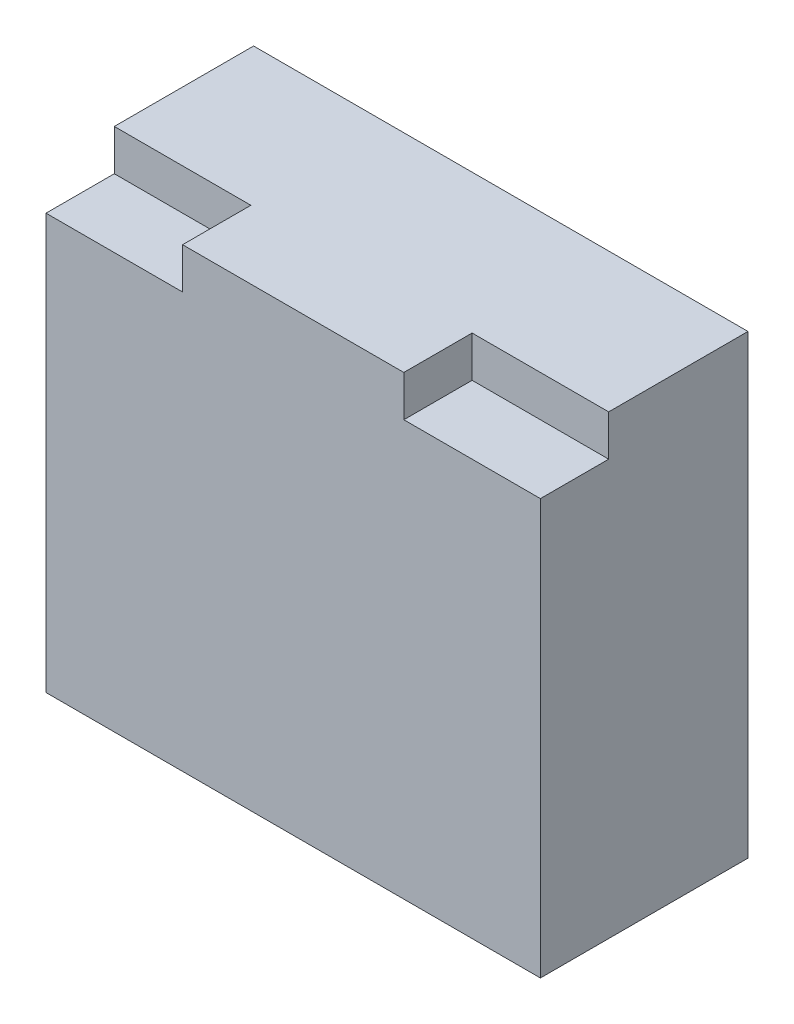
ISO-10303-21;
HEADER;
FILE_DESCRIPTION(('STEP AP214'),'2;1');
FILE_NAME('part.step','',(''),(''),'','','');
FILE_SCHEMA(('AUTOMOTIVE_DESIGN { 1 0 10303 214 1 1 1 1 }'));
ENDSEC;
DATA;
#1=APPLICATION_CONTEXT('core data for automotive mechanical design processes');
#2=APPLICATION_PROTOCOL_DEFINITION('international standard','automotive_design',2000,#1);
#3=PRODUCT_CONTEXT('',#1,'mechanical');
#4=PRODUCT('Part','Part','',(#3));
#5=PRODUCT_RELATED_PRODUCT_CATEGORY('part','',(#4));
#6=PRODUCT_DEFINITION_FORMATION('','',#4);
#7=PRODUCT_DEFINITION_CONTEXT('part definition',#1,'design');
#8=PRODUCT_DEFINITION('design','',#6,#7);
#9=PRODUCT_DEFINITION_SHAPE('','',#8);
#10=(LENGTH_UNIT() NAMED_UNIT(*) SI_UNIT(.MILLI.,.METRE.));
#11=(NAMED_UNIT(*) PLANE_ANGLE_UNIT() SI_UNIT($,.RADIAN.));
#12=(NAMED_UNIT(*) SI_UNIT($,.STERADIAN.) SOLID_ANGLE_UNIT());
#13=UNCERTAINTY_MEASURE_WITH_UNIT(LENGTH_MEASURE(1.E-05),#10,'distance_accuracy_value','');
#14=(GEOMETRIC_REPRESENTATION_CONTEXT(3) GLOBAL_UNCERTAINTY_ASSIGNED_CONTEXT((#13)) GLOBAL_UNIT_ASSIGNED_CONTEXT((#10,
#11,#12)) REPRESENTATION_CONTEXT('',''));
#15=CARTESIAN_POINT('',(0.,0.,0.));
#16=DIRECTION('',(0.,0.,1.));
#17=DIRECTION('',(1.,0.,0.));
#18=AXIS2_PLACEMENT_3D('',#15,#16,#17);
#19=CARTESIAN_POINT('',(0.,167.,0.));
#20=DIRECTION('',(1.,0.,0.));
#21=DIRECTION('',(0.,0.,-1.));
#22=AXIS2_PLACEMENT_3D('',#19,#20,#21);
#23=PLANE('',#22);
#24=DIRECTION('',(0.,0.,1.));
#25=VECTOR('',#24,1.);
#26=CARTESIAN_POINT('',(0.,152.,76.));
#27=LINE('',#26,#25);
#28=CARTESIAN_POINT('',(0.,152.,51.));
#29=VERTEX_POINT('',#28);
#30=CARTESIAN_POINT('',(0.,152.,76.));
#31=VERTEX_POINT('',#30);
#32=EDGE_CURVE('E136',#29,#31,#27,.T.);
#33=ORIENTED_EDGE('',*,*,#32,.F.);
#34=DIRECTION('',(0.,1.,0.));
#35=VECTOR('',#34,1.);
#36=CARTESIAN_POINT('',(0.,152.,51.));
#37=LINE('',#36,#35);
#38=CARTESIAN_POINT('',(0.,167.,51.));
#39=VERTEX_POINT('',#38);
#40=EDGE_CURVE('E151',#29,#39,#37,.T.);
#41=ORIENTED_EDGE('',*,*,#40,.T.);
#42=DIRECTION('',(0.,0.,1.));
#43=VECTOR('',#42,1.);
#44=CARTESIAN_POINT('',(0.,167.,0.));
#45=LINE('',#44,#43);
#46=CARTESIAN_POINT('',(0.,167.,0.));
#47=VERTEX_POINT('',#46);
#48=EDGE_CURVE('E158',#47,#39,#45,.T.);
#49=ORIENTED_EDGE('',*,*,#48,.F.);
#50=DIRECTION('',(0.,-1.,0.));
#51=VECTOR('',#50,1.);
#52=CARTESIAN_POINT('',(0.,167.,0.));
#53=LINE('',#52,#51);
#54=CARTESIAN_POINT('',(0.,0.,0.));
#55=VERTEX_POINT('',#54);
#56=EDGE_CURVE('E168',#47,#55,#53,.T.);
#57=ORIENTED_EDGE('',*,*,#56,.T.);
#58=DIRECTION('',(0.,0.,1.));
#59=VECTOR('',#58,1.);
#60=CARTESIAN_POINT('',(0.,0.,0.));
#61=LINE('',#60,#59);
#62=CARTESIAN_POINT('',(0.,0.,76.));
#63=VERTEX_POINT('',#62);
#64=EDGE_CURVE('E169',#55,#63,#61,.T.);
#65=ORIENTED_EDGE('',*,*,#64,.T.);
#66=DIRECTION('',(0.,-1.,0.));
#67=VECTOR('',#66,1.);
#68=CARTESIAN_POINT('',(0.,167.,76.));
#69=LINE('',#68,#67);
#70=EDGE_CURVE('E11',#31,#63,#69,.T.);
#71=ORIENTED_EDGE('',*,*,#70,.F.);
#72=EDGE_LOOP('',(#33,#41,#49,#57,#65,#71));
#73=FACE_BOUND('',#72,.T.);
#74=ADVANCED_FACE('F33',(#73),#23,.F.);
#75=CARTESIAN_POINT('',(0.,167.,76.));
#76=DIRECTION('',(0.,0.,-1.));
#77=DIRECTION('',(-1.,0.,0.));
#78=AXIS2_PLACEMENT_3D('',#75,#76,#77);
#79=PLANE('',#78);
#80=DIRECTION('',(1.,0.,0.));
#81=VECTOR('',#80,1.);
#82=CARTESIAN_POINT('',(181.,152.,76.));
#83=LINE('',#82,#81);
#84=CARTESIAN_POINT('',(131.,152.,76.));
#85=VERTEX_POINT('',#84);
#86=CARTESIAN_POINT('',(181.,152.,76.));
#87=VERTEX_POINT('',#86);
#88=EDGE_CURVE('E121',#85,#87,#83,.T.);
#89=ORIENTED_EDGE('',*,*,#88,.F.);
#90=DIRECTION('',(0.,1.,0.));
#91=VECTOR('',#90,1.);
#92=CARTESIAN_POINT('',(131.,152.,76.));
#93=LINE('',#92,#91);
#94=CARTESIAN_POINT('',(131.,167.,76.));
#95=VERTEX_POINT('',#94);
#96=EDGE_CURVE('E131',#85,#95,#93,.T.);
#97=ORIENTED_EDGE('',*,*,#96,.T.);
#98=DIRECTION('',(1.,0.,0.));
#99=VECTOR('',#98,1.);
#100=CARTESIAN_POINT('',(0.,167.,76.));
#101=LINE('',#100,#99);
#102=CARTESIAN_POINT('',(50.,167.,76.));
#103=VERTEX_POINT('',#102);
#104=EDGE_CURVE('E161',#103,#95,#101,.T.);
#105=ORIENTED_EDGE('',*,*,#104,.F.);
#106=DIRECTION('',(0.,1.,0.));
#107=VECTOR('',#106,1.);
#108=CARTESIAN_POINT('',(50.,152.,76.));
#109=LINE('',#108,#107);
#110=CARTESIAN_POINT('',(50.,152.,76.));
#111=VERTEX_POINT('',#110);
#112=EDGE_CURVE('E55',#111,#103,#109,.T.);
#113=ORIENTED_EDGE('',*,*,#112,.F.);
#114=DIRECTION('',(1.,0.,0.));
#115=VECTOR('',#114,1.);
#116=CARTESIAN_POINT('',(0.,152.,76.));
#117=LINE('',#116,#115);
#118=EDGE_CURVE('E138',#31,#111,#117,.T.);
#119=ORIENTED_EDGE('',*,*,#118,.F.);
#120=ORIENTED_EDGE('',*,*,#70,.T.);
#121=DIRECTION('',(1.,0.,0.));
#122=VECTOR('',#121,1.);
#123=CARTESIAN_POINT('',(0.,0.,76.));
#124=LINE('',#123,#122);
#125=CARTESIAN_POINT('',(181.,0.,76.));
#126=VERTEX_POINT('',#125);
#127=EDGE_CURVE('E172',#63,#126,#124,.T.);
#128=ORIENTED_EDGE('',*,*,#127,.T.);
#129=DIRECTION('',(0.,-1.,0.));
#130=VECTOR('',#129,1.);
#131=CARTESIAN_POINT('',(181.,167.,76.));
#132=LINE('',#131,#130);
#133=EDGE_CURVE('E40',#87,#126,#132,.T.);
#134=ORIENTED_EDGE('',*,*,#133,.F.);
#135=EDGE_LOOP('',(#89,#97,#105,#113,#119,#120,#128,#134));
#136=FACE_BOUND('',#135,.T.);
#137=ADVANCED_FACE('F185',(#136),#79,.F.);
#138=CARTESIAN_POINT('',(181.,167.,0.));
#139=DIRECTION('',(-1.,0.,0.));
#140=DIRECTION('',(0.,0.,1.));
#141=AXIS2_PLACEMENT_3D('',#138,#139,#140);
#142=PLANE('',#141);
#143=DIRECTION('',(0.,0.,-1.));
#144=VECTOR('',#143,1.);
#145=CARTESIAN_POINT('',(181.,167.,0.));
#146=LINE('',#145,#144);
#147=CARTESIAN_POINT('',(181.,167.,51.));
#148=VERTEX_POINT('',#147);
#149=CARTESIAN_POINT('',(181.,167.,0.));
#150=VERTEX_POINT('',#149);
#151=EDGE_CURVE('E129',#148,#150,#146,.T.);
#152=ORIENTED_EDGE('',*,*,#151,.F.);
#153=DIRECTION('',(0.,1.,0.));
#154=VECTOR('',#153,1.);
#155=CARTESIAN_POINT('',(181.,152.,51.));
#156=LINE('',#155,#154);
#157=CARTESIAN_POINT('',(181.,152.,51.));
#158=VERTEX_POINT('',#157);
#159=EDGE_CURVE('E47',#158,#148,#156,.T.);
#160=ORIENTED_EDGE('',*,*,#159,.F.);
#161=DIRECTION('',(0.,0.,-1.));
#162=VECTOR('',#161,1.);
#163=CARTESIAN_POINT('',(181.,152.,76.));
#164=LINE('',#163,#162);
#165=EDGE_CURVE('E116',#87,#158,#164,.T.);
#166=ORIENTED_EDGE('',*,*,#165,.F.);
#167=ORIENTED_EDGE('',*,*,#133,.T.);
#168=DIRECTION('',(0.,0.,-1.));
#169=VECTOR('',#168,1.);
#170=CARTESIAN_POINT('',(181.,0.,0.));
#171=LINE('',#170,#169);
#172=CARTESIAN_POINT('',(181.,0.,0.));
#173=VERTEX_POINT('',#172);
#174=EDGE_CURVE('E175',#126,#173,#171,.T.);
#175=ORIENTED_EDGE('',*,*,#174,.T.);
#176=DIRECTION('',(0.,-1.,0.));
#177=VECTOR('',#176,1.);
#178=CARTESIAN_POINT('',(181.,167.,0.));
#179=LINE('',#178,#177);
#180=EDGE_CURVE('E180',#150,#173,#179,.T.);
#181=ORIENTED_EDGE('',*,*,#180,.F.);
#182=EDGE_LOOP('',(#152,#160,#166,#167,#175,#181));
#183=FACE_BOUND('',#182,.T.);
#184=ADVANCED_FACE('F127',(#183),#142,.F.);
#185=CARTESIAN_POINT('',(0.,167.,0.));
#186=DIRECTION('',(0.,0.,1.));
#187=DIRECTION('',(1.,0.,0.));
#188=AXIS2_PLACEMENT_3D('',#185,#186,#187);
#189=PLANE('',#188);
#190=DIRECTION('',(-1.,0.,0.));
#191=VECTOR('',#190,1.);
#192=CARTESIAN_POINT('',(0.,0.,0.));
#193=LINE('',#192,#191);
#194=EDGE_CURVE('E162',#173,#55,#193,.T.);
#195=ORIENTED_EDGE('',*,*,#194,.T.);
#196=ORIENTED_EDGE('',*,*,#56,.F.);
#197=DIRECTION('',(-1.,0.,0.));
#198=VECTOR('',#197,1.);
#199=CARTESIAN_POINT('',(0.,167.,0.));
#200=LINE('',#199,#198);
#201=EDGE_CURVE('E166',#150,#47,#200,.T.);
#202=ORIENTED_EDGE('',*,*,#201,.F.);
#203=ORIENTED_EDGE('',*,*,#180,.T.);
#204=EDGE_LOOP('',(#195,#196,#202,#203));
#205=FACE_BOUND('',#204,.T.);
#206=ADVANCED_FACE('F194',(#205),#189,.F.);
#207=CARTESIAN_POINT('',(0.,167.,0.));
#208=DIRECTION('',(0.,1.,0.));
#209=DIRECTION('',(0.,0.,1.));
#210=AXIS2_PLACEMENT_3D('',#207,#208,#209);
#211=PLANE('',#210);
#212=DIRECTION('',(0.,0.,1.));
#213=VECTOR('',#212,1.);
#214=CARTESIAN_POINT('',(131.,167.,76.));
#215=LINE('',#214,#213);
#216=CARTESIAN_POINT('',(131.,167.,51.));
#217=VERTEX_POINT('',#216);
#218=EDGE_CURVE('E124',#217,#95,#215,.T.);
#219=ORIENTED_EDGE('',*,*,#218,.F.);
#220=DIRECTION('',(-1.,0.,0.));
#221=VECTOR('',#220,1.);
#222=CARTESIAN_POINT('',(181.,167.,51.));
#223=LINE('',#222,#221);
#224=EDGE_CURVE('E154',#148,#217,#223,.T.);
#225=ORIENTED_EDGE('',*,*,#224,.F.);
#226=ORIENTED_EDGE('',*,*,#151,.T.);
#227=ORIENTED_EDGE('',*,*,#201,.T.);
#228=ORIENTED_EDGE('',*,*,#48,.T.);
#229=DIRECTION('',(-1.,0.,0.));
#230=VECTOR('',#229,1.);
#231=CARTESIAN_POINT('',(0.,167.,51.));
#232=LINE('',#231,#230);
#233=CARTESIAN_POINT('',(50.,167.,51.));
#234=VERTEX_POINT('',#233);
#235=EDGE_CURVE('E139',#234,#39,#232,.T.);
#236=ORIENTED_EDGE('',*,*,#235,.F.);
#237=DIRECTION('',(0.,0.,-1.));
#238=VECTOR('',#237,1.);
#239=CARTESIAN_POINT('',(50.,167.,76.));
#240=LINE('',#239,#238);
#241=EDGE_CURVE('E148',#103,#234,#240,.T.);
#242=ORIENTED_EDGE('',*,*,#241,.F.);
#243=ORIENTED_EDGE('',*,*,#104,.T.);
#244=EDGE_LOOP('',(#219,#225,#226,#227,#228,#236,#242,#243));
#245=FACE_BOUND('',#244,.T.);
#246=ADVANCED_FACE('F202',(#245),#211,.T.);
#247=CARTESIAN_POINT('',(0.,0.,0.));
#248=DIRECTION('',(0.,1.,0.));
#249=DIRECTION('',(0.,0.,1.));
#250=AXIS2_PLACEMENT_3D('',#247,#248,#249);
#251=PLANE('',#250);
#252=ORIENTED_EDGE('',*,*,#64,.F.);
#253=ORIENTED_EDGE('',*,*,#194,.F.);
#254=ORIENTED_EDGE('',*,*,#174,.F.);
#255=ORIENTED_EDGE('',*,*,#127,.F.);
#256=EDGE_LOOP('',(#252,#253,#254,#255));
#257=FACE_BOUND('',#256,.T.);
#258=ADVANCED_FACE('F191',(#257),#251,.F.);
#259=CARTESIAN_POINT('',(0.,152.,51.));
#260=DIRECTION('',(0.,0.,-1.));
#261=DIRECTION('',(-1.,0.,0.));
#262=AXIS2_PLACEMENT_3D('',#259,#260,#261);
#263=PLANE('',#262);
#264=ORIENTED_EDGE('',*,*,#235,.T.);
#265=ORIENTED_EDGE('',*,*,#40,.F.);
#266=DIRECTION('',(-1.,0.,0.));
#267=VECTOR('',#266,1.);
#268=CARTESIAN_POINT('',(0.,152.,51.));
#269=LINE('',#268,#267);
#270=CARTESIAN_POINT('',(50.,152.,51.));
#271=VERTEX_POINT('',#270);
#272=EDGE_CURVE('E145',#271,#29,#269,.T.);
#273=ORIENTED_EDGE('',*,*,#272,.F.);
#274=DIRECTION('',(0.,1.,0.));
#275=VECTOR('',#274,1.);
#276=CARTESIAN_POINT('',(50.,152.,51.));
#277=LINE('',#276,#275);
#278=EDGE_CURVE('E155',#271,#234,#277,.T.);
#279=ORIENTED_EDGE('',*,*,#278,.T.);
#280=EDGE_LOOP('',(#264,#265,#273,#279));
#281=FACE_BOUND('',#280,.T.);
#282=ADVANCED_FACE('F214',(#281),#263,.F.);
#283=CARTESIAN_POINT('',(50.,152.,76.));
#284=DIRECTION('',(1.,0.,0.));
#285=DIRECTION('',(0.,0.,-1.));
#286=AXIS2_PLACEMENT_3D('',#283,#284,#285);
#287=PLANE('',#286);
#288=ORIENTED_EDGE('',*,*,#241,.T.);
#289=ORIENTED_EDGE('',*,*,#278,.F.);
#290=DIRECTION('',(0.,0.,-1.));
#291=VECTOR('',#290,1.);
#292=CARTESIAN_POINT('',(50.,152.,76.));
#293=LINE('',#292,#291);
#294=EDGE_CURVE('E142',#111,#271,#293,.T.);
#295=ORIENTED_EDGE('',*,*,#294,.F.);
#296=ORIENTED_EDGE('',*,*,#112,.T.);
#297=EDGE_LOOP('',(#288,#289,#295,#296));
#298=FACE_BOUND('',#297,.T.);
#299=ADVANCED_FACE('F209',(#298),#287,.F.);
#300=CARTESIAN_POINT('',(0.,152.,0.));
#301=DIRECTION('',(0.,-1.,0.));
#302=DIRECTION('',(0.,0.,-1.));
#303=AXIS2_PLACEMENT_3D('',#300,#301,#302);
#304=PLANE('',#303);
#305=ORIENTED_EDGE('',*,*,#32,.T.);
#306=ORIENTED_EDGE('',*,*,#118,.T.);
#307=ORIENTED_EDGE('',*,*,#294,.T.);
#308=ORIENTED_EDGE('',*,*,#272,.T.);
#309=EDGE_LOOP('',(#305,#306,#307,#308));
#310=FACE_BOUND('',#309,.T.);
#311=ADVANCED_FACE('F213',(#310),#304,.F.);
#312=CARTESIAN_POINT('',(131.,152.,76.));
#313=DIRECTION('',(-1.,0.,0.));
#314=DIRECTION('',(0.,0.,1.));
#315=AXIS2_PLACEMENT_3D('',#312,#313,#314);
#316=PLANE('',#315);
#317=ORIENTED_EDGE('',*,*,#218,.T.);
#318=ORIENTED_EDGE('',*,*,#96,.F.);
#319=DIRECTION('',(0.,0.,1.));
#320=VECTOR('',#319,1.);
#321=CARTESIAN_POINT('',(131.,152.,76.));
#322=LINE('',#321,#320);
#323=CARTESIAN_POINT('',(131.,152.,51.));
#324=VERTEX_POINT('',#323);
#325=EDGE_CURVE('E115',#324,#85,#322,.T.);
#326=ORIENTED_EDGE('',*,*,#325,.F.);
#327=DIRECTION('',(0.,1.,0.));
#328=VECTOR('',#327,1.);
#329=CARTESIAN_POINT('',(131.,152.,51.));
#330=LINE('',#329,#328);
#331=EDGE_CURVE('E111',#324,#217,#330,.T.);
#332=ORIENTED_EDGE('',*,*,#331,.T.);
#333=EDGE_LOOP('',(#317,#318,#326,#332));
#334=FACE_BOUND('',#333,.T.);
#335=ADVANCED_FACE('F283',(#334),#316,.F.);
#336=CARTESIAN_POINT('',(181.,152.,51.));
#337=DIRECTION('',(0.,0.,-1.));
#338=DIRECTION('',(-1.,0.,0.));
#339=AXIS2_PLACEMENT_3D('',#336,#337,#338);
#340=PLANE('',#339);
#341=ORIENTED_EDGE('',*,*,#224,.T.);
#342=ORIENTED_EDGE('',*,*,#331,.F.);
#343=DIRECTION('',(-1.,0.,0.));
#344=VECTOR('',#343,1.);
#345=CARTESIAN_POINT('',(181.,152.,51.));
#346=LINE('',#345,#344);
#347=EDGE_CURVE('E108',#158,#324,#346,.T.);
#348=ORIENTED_EDGE('',*,*,#347,.F.);
#349=ORIENTED_EDGE('',*,*,#159,.T.);
#350=EDGE_LOOP('',(#341,#342,#348,#349));
#351=FACE_BOUND('',#350,.T.);
#352=ADVANCED_FACE('F110',(#351),#340,.F.);
#353=CARTESIAN_POINT('',(0.,152.,0.));
#354=DIRECTION('',(0.,1.,0.));
#355=DIRECTION('',(0.,0.,1.));
#356=AXIS2_PLACEMENT_3D('',#353,#354,#355);
#357=PLANE('',#356);
#358=ORIENTED_EDGE('',*,*,#165,.T.);
#359=ORIENTED_EDGE('',*,*,#347,.T.);
#360=ORIENTED_EDGE('',*,*,#325,.T.);
#361=ORIENTED_EDGE('',*,*,#88,.T.);
#362=EDGE_LOOP('',(#358,#359,#360,#361));
#363=FACE_BOUND('',#362,.T.);
#364=ADVANCED_FACE('F119',(#363),#357,.T.);
#365=CLOSED_SHELL('',(#74,#137,#184,#206,#246,#258,#282,#299,#311,#335,#352,#364));
#366=MANIFOLD_SOLID_BREP('B2',#365);
#367=ADVANCED_BREP_SHAPE_REPRESENTATION('',(#18,#366),#14);
#368=SHAPE_DEFINITION_REPRESENTATION(#9,#367);
ENDSEC;
END-ISO-10303-21;
